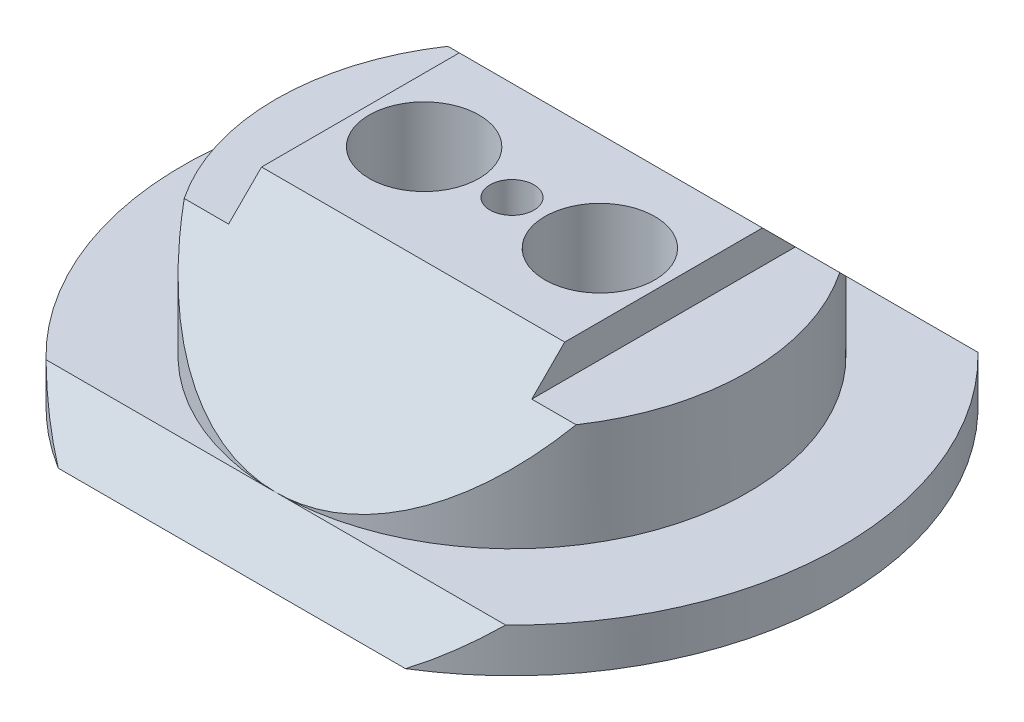
ISO-10303-21;
HEADER;
FILE_DESCRIPTION(('STEP AP214'),'2;1');
FILE_NAME('part.step','',(''),(''),'','','');
FILE_SCHEMA(('AUTOMOTIVE_DESIGN { 1 0 10303 214 1 1 1 1 }'));
ENDSEC;
DATA;
#1=APPLICATION_CONTEXT('core data for automotive mechanical design processes');
#2=APPLICATION_PROTOCOL_DEFINITION('international standard','automotive_design',2000,#1);
#3=PRODUCT_CONTEXT('',#1,'mechanical');
#4=PRODUCT('Part','Part','',(#3));
#5=PRODUCT_RELATED_PRODUCT_CATEGORY('part','',(#4));
#6=PRODUCT_DEFINITION_FORMATION('','',#4);
#7=PRODUCT_DEFINITION_CONTEXT('part definition',#1,'design');
#8=PRODUCT_DEFINITION('design','',#6,#7);
#9=PRODUCT_DEFINITION_SHAPE('','',#8);
#10=(LENGTH_UNIT() NAMED_UNIT(*) SI_UNIT(.MILLI.,.METRE.));
#11=(NAMED_UNIT(*) PLANE_ANGLE_UNIT() SI_UNIT($,.RADIAN.));
#12=(NAMED_UNIT(*) SI_UNIT($,.STERADIAN.) SOLID_ANGLE_UNIT());
#13=UNCERTAINTY_MEASURE_WITH_UNIT(LENGTH_MEASURE(1.E-05),#10,'distance_accuracy_value','');
#14=(GEOMETRIC_REPRESENTATION_CONTEXT(3) GLOBAL_UNCERTAINTY_ASSIGNED_CONTEXT((#13)) GLOBAL_UNIT_ASSIGNED_CONTEXT((#10,
#11,#12)) REPRESENTATION_CONTEXT('',''));
#15=CARTESIAN_POINT('',(0.,0.,0.));
#16=DIRECTION('',(0.,0.,1.));
#17=DIRECTION('',(1.,0.,0.));
#18=AXIS2_PLACEMENT_3D('',#15,#16,#17);
#19=CARTESIAN_POINT('',(0.,20.,0.));
#20=DIRECTION('',(0.,-1.,0.));
#21=DIRECTION('',(0.,0.,-1.));
#22=AXIS2_PLACEMENT_3D('',#19,#20,#21);
#23=CYLINDRICAL_SURFACE('',#22,1.5);
#24=CARTESIAN_POINT('',(0.,0.,0.));
#25=DIRECTION('',(0.,-1.,0.));
#26=DIRECTION('',(0.,0.,-1.));
#27=AXIS2_PLACEMENT_3D('',#24,#25,#26);
#28=CIRCLE('',#27,1.5);
#29=CARTESIAN_POINT('',(0.,0.,-1.5));
#30=VERTEX_POINT('',#29);
#31=EDGE_CURVE('E157',#30,#30,#28,.T.);
#32=ORIENTED_EDGE('',*,*,#31,.T.);
#33=EDGE_LOOP('',(#32));
#34=FACE_BOUND('',#33,.T.);
#35=CARTESIAN_POINT('',(0.,13.5,0.));
#36=DIRECTION('',(0.,1.,0.));
#37=DIRECTION('',(0.,0.,1.));
#38=AXIS2_PLACEMENT_3D('',#35,#36,#37);
#39=CIRCLE('',#38,1.5);
#40=CARTESIAN_POINT('',(0.,13.5,1.5));
#41=VERTEX_POINT('',#40);
#42=EDGE_CURVE('E61',#41,#41,#39,.F.);
#43=ORIENTED_EDGE('',*,*,#42,.F.);
#44=EDGE_LOOP('',(#43));
#45=FACE_BOUND('',#44,.T.);
#46=ADVANCED_FACE('F57',(#34,#45),#23,.F.);
#47=CARTESIAN_POINT('',(0.,0.,0.));
#48=DIRECTION('',(0.,1.,0.));
#49=DIRECTION('',(0.,0.,1.));
#50=AXIS2_PLACEMENT_3D('',#47,#48,#49);
#51=PLANE('',#50);
#52=CARTESIAN_POINT('',(-14.,0.,12.));
#53=DIRECTION('',(0.,-1.,0.));
#54=DIRECTION('',(0.,0.,-1.));
#55=AXIS2_PLACEMENT_3D('',#52,#53,#54);
#56=CIRCLE('',#55,5.);
#57=CARTESIAN_POINT('',(-14.,0.,7.));
#58=VERTEX_POINT('',#57);
#59=EDGE_CURVE('E626',#58,#58,#56,.T.);
#60=ORIENTED_EDGE('',*,*,#59,.F.);
#61=EDGE_LOOP('',(#60));
#62=FACE_BOUND('',#61,.T.);
#63=CARTESIAN_POINT('',(22.,0.,0.));
#64=DIRECTION('',(0.,-1.,0.));
#65=DIRECTION('',(0.,0.,-1.));
#66=AXIS2_PLACEMENT_3D('',#63,#64,#65);
#67=CIRCLE('',#66,5.);
#68=CARTESIAN_POINT('',(22.,0.,-5.));
#69=VERTEX_POINT('',#68);
#70=EDGE_CURVE('E625',#69,#69,#67,.T.);
#71=ORIENTED_EDGE('',*,*,#70,.F.);
#72=EDGE_LOOP('',(#71));
#73=FACE_BOUND('',#72,.T.);
#74=CARTESIAN_POINT('',(-22.,0.,0.));
#75=DIRECTION('',(0.,-1.,0.));
#76=DIRECTION('',(0.,0.,-1.));
#77=AXIS2_PLACEMENT_3D('',#74,#75,#76);
#78=CIRCLE('',#77,5.);
#79=CARTESIAN_POINT('',(-22.,0.,-5.));
#80=VERTEX_POINT('',#79);
#81=EDGE_CURVE('E651',#80,#80,#78,.T.);
#82=ORIENTED_EDGE('',*,*,#81,.F.);
#83=EDGE_LOOP('',(#82));
#84=FACE_BOUND('',#83,.T.);
#85=CARTESIAN_POINT('',(0.,0.,15.));
#86=DIRECTION('',(0.,-1.,0.));
#87=DIRECTION('',(0.,0.,-1.));
#88=AXIS2_PLACEMENT_3D('',#85,#86,#87);
#89=CIRCLE('',#88,5.);
#90=CARTESIAN_POINT('',(0.,0.,10.));
#91=VERTEX_POINT('',#90);
#92=EDGE_CURVE('E643',#91,#91,#89,.T.);
#93=ORIENTED_EDGE('',*,*,#92,.F.);
#94=EDGE_LOOP('',(#93));
#95=FACE_BOUND('',#94,.T.);
#96=CARTESIAN_POINT('',(14.,0.,-12.));
#97=DIRECTION('',(0.,-1.,0.));
#98=DIRECTION('',(0.,0.,-1.));
#99=AXIS2_PLACEMENT_3D('',#96,#97,#98);
#100=CIRCLE('',#99,5.);
#101=CARTESIAN_POINT('',(14.,0.,-17.));
#102=VERTEX_POINT('',#101);
#103=EDGE_CURVE('E698',#102,#102,#100,.T.);
#104=ORIENTED_EDGE('',*,*,#103,.F.);
#105=EDGE_LOOP('',(#104));
#106=FACE_BOUND('',#105,.T.);
#107=CARTESIAN_POINT('',(-14.,0.,-12.));
#108=DIRECTION('',(0.,-1.,0.));
#109=DIRECTION('',(0.,0.,-1.));
#110=AXIS2_PLACEMENT_3D('',#107,#108,#109);
#111=CIRCLE('',#110,5.);
#112=CARTESIAN_POINT('',(-14.,0.,-17.));
#113=VERTEX_POINT('',#112);
#114=EDGE_CURVE('E682',#113,#113,#111,.T.);
#115=ORIENTED_EDGE('',*,*,#114,.F.);
#116=EDGE_LOOP('',(#115));
#117=FACE_BOUND('',#116,.T.);
#118=CARTESIAN_POINT('',(14.,0.,12.));
#119=DIRECTION('',(0.,-1.,0.));
#120=DIRECTION('',(0.,0.,-1.));
#121=AXIS2_PLACEMENT_3D('',#118,#119,#120);
#122=CIRCLE('',#121,5.);
#123=CARTESIAN_POINT('',(14.,0.,7.));
#124=VERTEX_POINT('',#123);
#125=EDGE_CURVE('E691',#124,#124,#122,.T.);
#126=ORIENTED_EDGE('',*,*,#125,.F.);
#127=EDGE_LOOP('',(#126));
#128=FACE_BOUND('',#127,.T.);
#129=CARTESIAN_POINT('',(0.,0.,-15.));
#130=DIRECTION('',(0.,-1.,0.));
#131=DIRECTION('',(0.,0.,-1.));
#132=AXIS2_PLACEMENT_3D('',#129,#130,#131);
#133=CIRCLE('',#132,5.);
#134=CARTESIAN_POINT('',(0.,0.,-20.));
#135=VERTEX_POINT('',#134);
#136=EDGE_CURVE('E642',#135,#135,#133,.T.);
#137=ORIENTED_EDGE('',*,*,#136,.F.);
#138=EDGE_LOOP('',(#137));
#139=FACE_BOUND('',#138,.T.);
#140=ORIENTED_EDGE('',*,*,#31,.F.);
#141=EDGE_LOOP('',(#140));
#142=FACE_BOUND('',#141,.T.);
#143=CARTESIAN_POINT('',(-8.,0.,0.));
#144=DIRECTION('',(0.,1.,0.));
#145=DIRECTION('',(0.,0.,1.));
#146=AXIS2_PLACEMENT_3D('',#143,#144,#145);
#147=CIRCLE('',#146,5.005);
#148=CARTESIAN_POINT('',(-8.,0.,5.005));
#149=VERTEX_POINT('',#148);
#150=EDGE_CURVE('E197',#149,#149,#147,.T.);
#151=ORIENTED_EDGE('',*,*,#150,.T.);
#152=EDGE_LOOP('',(#151));
#153=FACE_BOUND('',#152,.T.);
#154=CARTESIAN_POINT('',(8.,0.,0.));
#155=DIRECTION('',(0.,1.,0.));
#156=DIRECTION('',(0.,0.,1.));
#157=AXIS2_PLACEMENT_3D('',#154,#155,#156);
#158=CIRCLE('',#157,5.005);
#159=CARTESIAN_POINT('',(8.,0.,5.005));
#160=VERTEX_POINT('',#159);
#161=EDGE_CURVE('E190',#160,#160,#158,.T.);
#162=ORIENTED_EDGE('',*,*,#161,.T.);
#163=EDGE_LOOP('',(#162));
#164=FACE_BOUND('',#163,.T.);
#165=DIRECTION('',(1.,0.,0.));
#166=VECTOR('',#165,1.);
#167=CARTESIAN_POINT('',(0.,0.,25.5));
#168=LINE('',#167,#166);
#169=CARTESIAN_POINT('',(-15.8034806292791,0.,25.5));
#170=VERTEX_POINT('',#169);
#171=CARTESIAN_POINT('',(15.8034806292791,0.,25.5));
#172=VERTEX_POINT('',#171);
#173=EDGE_CURVE('E220',#170,#172,#168,.T.);
#174=ORIENTED_EDGE('',*,*,#173,.F.);
#175=CARTESIAN_POINT('',(0.,0.,0.));
#176=DIRECTION('',(0.,1.,0.));
#177=DIRECTION('',(0.,0.,1.));
#178=AXIS2_PLACEMENT_3D('',#175,#176,#177);
#179=CIRCLE('',#178,30.);
#180=CARTESIAN_POINT('',(-15.8034806292789,0.,-25.5000000000001));
#181=VERTEX_POINT('',#180);
#182=EDGE_CURVE('E250',#181,#170,#179,.T.);
#183=ORIENTED_EDGE('',*,*,#182,.F.);
#184=DIRECTION('',(-1.,0.,0.));
#185=VECTOR('',#184,1.);
#186=CARTESIAN_POINT('',(0.,0.,-25.5000000000001));
#187=LINE('',#186,#185);
#188=CARTESIAN_POINT('',(15.8034806292789,0.,-25.5000000000001));
#189=VERTEX_POINT('',#188);
#190=EDGE_CURVE('E224',#189,#181,#187,.T.);
#191=ORIENTED_EDGE('',*,*,#190,.F.);
#192=EDGE_CURVE('E239',#172,#189,#179,.T.);
#193=ORIENTED_EDGE('',*,*,#192,.F.);
#194=EDGE_LOOP('',(#174,#183,#191,#193));
#195=FACE_BOUND('',#194,.T.);
#196=ADVANCED_FACE('F307',(#62,#73,#84,#95,#106,#117,#128,#139,#142,#153,#164,#195),#51,.F.);
#197=CARTESIAN_POINT('',(0.,4.,0.));
#198=DIRECTION('',(0.,-1.,0.));
#199=DIRECTION('',(0.,0.,-1.));
#200=AXIS2_PLACEMENT_3D('',#197,#198,#199);
#201=CYLINDRICAL_SURFACE('',#200,30.);
#202=CARTESIAN_POINT('',(0.,4.,0.));
#203=DIRECTION('',(0.,1.,0.));
#204=DIRECTION('',(0.,0.,1.));
#205=AXIS2_PLACEMENT_3D('',#202,#203,#204);
#206=CIRCLE('',#205,30.);
#207=CARTESIAN_POINT('',(20.9224759529077,4.,21.5));
#208=VERTEX_POINT('',#207);
#209=CARTESIAN_POINT('',(20.9224759529077,4.,-21.5));
#210=VERTEX_POINT('',#209);
#211=EDGE_CURVE('E213',#208,#210,#206,.T.);
#212=ORIENTED_EDGE('',*,*,#211,.F.);
#213=CARTESIAN_POINT('',(0.,25.4999999999998,0.));
#214=DIRECTION('',(0.,-0.707106781186551,-0.707106781186544));
#215=DIRECTION('',(0.,-0.707106781186544,0.707106781186551));
#216=AXIS2_PLACEMENT_3D('',#213,#214,#215);
#217=ELLIPSE('',#216,42.4264068711926,30.);
#218=EDGE_CURVE('E240',#172,#208,#217,.F.);
#219=ORIENTED_EDGE('',*,*,#218,.F.);
#220=ORIENTED_EDGE('',*,*,#192,.T.);
#221=CARTESIAN_POINT('',(0.,25.4999999999995,0.));
#222=DIRECTION('',(0.,-0.707106781186556,0.707106781186539));
#223=DIRECTION('',(0.,-0.707106781186539,-0.707106781186556));
#224=AXIS2_PLACEMENT_3D('',#221,#222,#223);
#225=ELLIPSE('',#224,42.4264068711924,30.);
#226=EDGE_CURVE('E236',#210,#189,#225,.F.);
#227=ORIENTED_EDGE('',*,*,#226,.F.);
#228=EDGE_LOOP('',(#212,#219,#220,#227));
#229=FACE_BOUND('',#228,.T.);
#230=ADVANCED_FACE('F59',(#229),#201,.T.);
#231=CARTESIAN_POINT('',(0.,4.,0.));
#232=DIRECTION('',(0.,1.,0.));
#233=DIRECTION('',(0.,0.,1.));
#234=AXIS2_PLACEMENT_3D('',#231,#232,#233);
#235=CIRCLE('',#234,30.);
#236=CARTESIAN_POINT('',(-20.9224759529077,4.,-21.5));
#237=VERTEX_POINT('',#236);
#238=CARTESIAN_POINT('',(-20.9224759529077,4.,21.5));
#239=VERTEX_POINT('',#238);
#240=EDGE_CURVE('E210',#237,#239,#235,.T.);
#241=ORIENTED_EDGE('',*,*,#240,.F.);
#242=CARTESIAN_POINT('',(0.,25.4999999999995,0.));
#243=DIRECTION('',(0.,0.707106781186556,-0.707106781186539));
#244=DIRECTION('',(0.,-0.707106781186539,-0.707106781186556));
#245=AXIS2_PLACEMENT_3D('',#242,#243,#244);
#246=ELLIPSE('',#245,42.4264068711924,30.);
#247=EDGE_CURVE('E228',#237,#181,#246,.F.);
#248=ORIENTED_EDGE('',*,*,#247,.T.);
#249=ORIENTED_EDGE('',*,*,#182,.T.);
#250=CARTESIAN_POINT('',(0.,25.4999999999998,0.));
#251=DIRECTION('',(0.,0.707106781186551,0.707106781186544));
#252=DIRECTION('',(0.,-0.707106781186544,0.707106781186551));
#253=AXIS2_PLACEMENT_3D('',#250,#251,#252);
#254=ELLIPSE('',#253,42.4264068711926,30.);
#255=EDGE_CURVE('E231',#170,#239,#254,.F.);
#256=ORIENTED_EDGE('',*,*,#255,.T.);
#257=EDGE_LOOP('',(#241,#248,#249,#256));
#258=FACE_BOUND('',#257,.T.);
#259=ADVANCED_FACE('F316',(#258),#201,.T.);
#260=CARTESIAN_POINT('',(30.001,16.5,8.99999999999987));
#261=DIRECTION('',(0.,-0.707106781186551,-0.707106781186544));
#262=DIRECTION('',(0.,0.707106781186544,-0.707106781186551));
#263=AXIS2_PLACEMENT_3D('',#260,#261,#262);
#264=PLANE('',#263);
#265=DIRECTION('',(1.,0.,0.));
#266=VECTOR('',#265,1.);
#267=CARTESIAN_POINT('',(30.001,4.,21.5));
#268=LINE('',#267,#266);
#269=CARTESIAN_POINT('',(0.,3.99999999999999,21.5));
#270=VERTEX_POINT('',#269);
#271=EDGE_CURVE('E219',#239,#270,#268,.T.);
#272=ORIENTED_EDGE('',*,*,#271,.F.);
#273=ORIENTED_EDGE('',*,*,#255,.F.);
#274=ORIENTED_EDGE('',*,*,#173,.T.);
#275=ORIENTED_EDGE('',*,*,#218,.T.);
#276=EDGE_CURVE('E216',#270,#208,#268,.T.);
#277=ORIENTED_EDGE('',*,*,#276,.F.);
#278=EDGE_LOOP('',(#272,#273,#274,#275,#277));
#279=FACE_BOUND('',#278,.T.);
#280=ADVANCED_FACE('F299',(#279),#264,.F.);
#281=CARTESIAN_POINT('',(30.001,16.5,-8.99999999999971));
#282=DIRECTION('',(0.,-0.707106781186556,0.707106781186539));
#283=DIRECTION('',(0.,-0.707106781186539,-0.707106781186556));
#284=AXIS2_PLACEMENT_3D('',#281,#282,#283);
#285=PLANE('',#284);
#286=DIRECTION('',(-1.,0.,0.));
#287=VECTOR('',#286,1.);
#288=CARTESIAN_POINT('',(30.001,4.,-21.5));
#289=LINE('',#288,#287);
#290=CARTESIAN_POINT('',(0.,4.,-21.5));
#291=VERTEX_POINT('',#290);
#292=EDGE_CURVE('E260',#210,#291,#289,.T.);
#293=ORIENTED_EDGE('',*,*,#292,.F.);
#294=ORIENTED_EDGE('',*,*,#226,.T.);
#295=ORIENTED_EDGE('',*,*,#190,.T.);
#296=ORIENTED_EDGE('',*,*,#247,.F.);
#297=EDGE_CURVE('E257',#291,#237,#289,.T.);
#298=ORIENTED_EDGE('',*,*,#297,.F.);
#299=EDGE_LOOP('',(#293,#294,#295,#296,#298));
#300=FACE_BOUND('',#299,.T.);
#301=ADVANCED_FACE('F314',(#300),#285,.F.);
#302=CARTESIAN_POINT('',(0.,96.0338927753446,0.));
#303=DIRECTION('',(0.,-1.,0.));
#304=DIRECTION('',(0.,0.,-1.));
#305=AXIS2_PLACEMENT_3D('',#302,#303,#304);
#306=CYLINDRICAL_SURFACE('',#305,21.5);
#307=CARTESIAN_POINT('',(0.,13.5,0.));
#308=DIRECTION('',(0.,-1.,0.));
#309=DIRECTION('',(1.,0.,0.));
#310=AXIS2_PLACEMENT_3D('',#307,#308,#309);
#311=CIRCLE('',#310,21.5);
#312=CARTESIAN_POINT('',(17.8395627749114,13.5,-11.9999999999998));
#313=VERTEX_POINT('',#312);
#314=CARTESIAN_POINT('',(17.8395627749114,13.5,11.9999999999999));
#315=VERTEX_POINT('',#314);
#316=EDGE_CURVE('E178',#313,#315,#311,.T.);
#317=ORIENTED_EDGE('',*,*,#316,.T.);
#318=CARTESIAN_POINT('',(0.,25.4999999999998,0.));
#319=DIRECTION('',(0.,-0.707106781186551,-0.707106781186544));
#320=DIRECTION('',(0.,-0.707106781186544,0.707106781186551));
#321=AXIS2_PLACEMENT_3D('',#318,#319,#320);
#322=ELLIPSE('',#321,30.4055915910214,21.5);
#323=EDGE_CURVE('E209',#270,#315,#322,.F.);
#324=ORIENTED_EDGE('',*,*,#323,.F.);
#325=CARTESIAN_POINT('',(0.,4.,0.));
#326=DIRECTION('',(0.,1.,0.));
#327=DIRECTION('',(0.,0.,1.));
#328=AXIS2_PLACEMENT_3D('',#325,#326,#327);
#329=CIRCLE('',#328,21.5);
#330=EDGE_CURVE('E202',#270,#291,#329,.T.);
#331=ORIENTED_EDGE('',*,*,#330,.T.);
#332=CARTESIAN_POINT('',(0.,25.4999999999995,0.));
#333=DIRECTION('',(0.,-0.707106781186556,0.707106781186539));
#334=DIRECTION('',(0.,-0.707106781186539,-0.707106781186556));
#335=AXIS2_PLACEMENT_3D('',#332,#333,#334);
#336=ELLIPSE('',#335,30.4055915910212,21.5);
#337=EDGE_CURVE('E254',#313,#291,#336,.F.);
#338=ORIENTED_EDGE('',*,*,#337,.F.);
#339=EDGE_LOOP('',(#317,#324,#331,#338));
#340=FACE_BOUND('',#339,.T.);
#341=ADVANCED_FACE('F290',(#340),#306,.T.);
#342=CARTESIAN_POINT('',(0.,4.,0.));
#343=DIRECTION('',(0.,1.,0.));
#344=DIRECTION('',(0.,0.,1.));
#345=AXIS2_PLACEMENT_3D('',#342,#343,#344);
#346=PLANE('',#345);
#347=ORIENTED_EDGE('',*,*,#276,.T.);
#348=ORIENTED_EDGE('',*,*,#211,.T.);
#349=ORIENTED_EDGE('',*,*,#292,.T.);
#350=ORIENTED_EDGE('',*,*,#330,.F.);
#351=EDGE_LOOP('',(#347,#348,#349,#350));
#352=FACE_BOUND('',#351,.T.);
#353=ADVANCED_FACE('F296',(#352),#346,.T.);
#354=ORIENTED_EDGE('',*,*,#271,.T.);
#355=EDGE_CURVE('E201',#291,#270,#329,.T.);
#356=ORIENTED_EDGE('',*,*,#355,.F.);
#357=ORIENTED_EDGE('',*,*,#297,.T.);
#358=ORIENTED_EDGE('',*,*,#240,.T.);
#359=EDGE_LOOP('',(#354,#356,#357,#358));
#360=FACE_BOUND('',#359,.T.);
#361=ADVANCED_FACE('F283',(#360),#346,.T.);
#362=CARTESIAN_POINT('',(-17.8395627749113,13.5,11.9999999999999));
#363=VERTEX_POINT('',#362);
#364=EDGE_CURVE('E206',#363,#270,#322,.F.);
#365=ORIENTED_EDGE('',*,*,#364,.F.);
#366=CARTESIAN_POINT('',(0.,13.5,0.));
#367=DIRECTION('',(0.,-1.,0.));
#368=DIRECTION('',(0.,0.,-1.));
#369=AXIS2_PLACEMENT_3D('',#366,#367,#368);
#370=CIRCLE('',#369,21.5);
#371=CARTESIAN_POINT('',(-17.8395627749114,13.5,-11.9999999999998));
#372=VERTEX_POINT('',#371);
#373=EDGE_CURVE('E74',#363,#372,#370,.T.);
#374=ORIENTED_EDGE('',*,*,#373,.T.);
#375=EDGE_CURVE('E162',#291,#372,#336,.F.);
#376=ORIENTED_EDGE('',*,*,#375,.F.);
#377=ORIENTED_EDGE('',*,*,#355,.T.);
#378=EDGE_LOOP('',(#365,#374,#376,#377));
#379=FACE_BOUND('',#378,.T.);
#380=ADVANCED_FACE('F275',(#379),#306,.T.);
#381=DIRECTION('',(1.,0.,0.));
#382=VECTOR('',#381,1.);
#383=CARTESIAN_POINT('',(30.001,13.5,-11.9999999999998));
#384=LINE('',#383,#382);
#385=CARTESIAN_POINT('',(-13.8,13.5,-11.9999999999998));
#386=VERTEX_POINT('',#385);
#387=EDGE_CURVE('E153',#372,#386,#384,.T.);
#388=ORIENTED_EDGE('',*,*,#387,.T.);
#389=DIRECTION('',(0.,0.707106781186539,0.707106781186556));
#390=VECTOR('',#389,1.);
#391=CARTESIAN_POINT('',(-13.8,16.5,-8.99999999999971));
#392=LINE('',#391,#390);
#393=CARTESIAN_POINT('',(-13.8,16.5,-8.99999999999971));
#394=VERTEX_POINT('',#393);
#395=EDGE_CURVE('E142',#386,#394,#392,.T.);
#396=ORIENTED_EDGE('',*,*,#395,.T.);
#397=DIRECTION('',(-1.,0.,0.));
#398=VECTOR('',#397,1.);
#399=CARTESIAN_POINT('',(30.001,16.5,-8.99999999999971));
#400=LINE('',#399,#398);
#401=CARTESIAN_POINT('',(13.8,16.5,-8.99999999999971));
#402=VERTEX_POINT('',#401);
#403=EDGE_CURVE('E244',#402,#394,#400,.T.);
#404=ORIENTED_EDGE('',*,*,#403,.F.);
#405=DIRECTION('',(0.,-0.707106781186539,-0.707106781186556));
#406=VECTOR('',#405,1.);
#407=CARTESIAN_POINT('',(13.8,16.5,-8.99999999999971));
#408=LINE('',#407,#406);
#409=CARTESIAN_POINT('',(13.8,13.5,-11.9999999999998));
#410=VERTEX_POINT('',#409);
#411=EDGE_CURVE('E172',#402,#410,#408,.T.);
#412=ORIENTED_EDGE('',*,*,#411,.T.);
#413=DIRECTION('',(1.,0.,0.));
#414=VECTOR('',#413,1.);
#415=CARTESIAN_POINT('',(30.001,13.5,-11.9999999999998));
#416=LINE('',#415,#414);
#417=EDGE_CURVE('E181',#410,#313,#416,.T.);
#418=ORIENTED_EDGE('',*,*,#417,.T.);
#419=ORIENTED_EDGE('',*,*,#337,.T.);
#420=ORIENTED_EDGE('',*,*,#375,.T.);
#421=EDGE_LOOP('',(#388,#396,#404,#412,#418,#419,#420));
#422=FACE_BOUND('',#421,.T.);
#423=ADVANCED_FACE('F160',(#422),#285,.F.);
#424=CARTESIAN_POINT('',(30.001,16.5,8.99999999999987));
#425=DIRECTION('',(0.,-1.,0.));
#426=DIRECTION('',(0.,0.,-1.));
#427=AXIS2_PLACEMENT_3D('',#424,#425,#426);
#428=PLANE('',#427);
#429=CARTESIAN_POINT('',(0.,16.5,0.));
#430=DIRECTION('',(0.,1.,0.));
#431=DIRECTION('',(0.,0.,1.));
#432=AXIS2_PLACEMENT_3D('',#429,#430,#431);
#433=CIRCLE('',#432,2.);
#434=CARTESIAN_POINT('',(0.,16.5,2.00000000000001));
#435=VERTEX_POINT('',#434);
#436=EDGE_CURVE('E659',#435,#435,#433,.T.);
#437=ORIENTED_EDGE('',*,*,#436,.F.);
#438=EDGE_LOOP('',(#437));
#439=FACE_BOUND('',#438,.T.);
#440=CARTESIAN_POINT('',(-8.,16.5,0.));
#441=DIRECTION('',(0.,1.,0.));
#442=DIRECTION('',(0.,0.,1.));
#443=AXIS2_PLACEMENT_3D('',#440,#441,#442);
#444=CIRCLE('',#443,5.005);
#445=CARTESIAN_POINT('',(-8.,16.5,5.00500000000001));
#446=VERTEX_POINT('',#445);
#447=EDGE_CURVE('E186',#446,#446,#444,.T.);
#448=ORIENTED_EDGE('',*,*,#447,.F.);
#449=EDGE_LOOP('',(#448));
#450=FACE_BOUND('',#449,.T.);
#451=CARTESIAN_POINT('',(8.,16.5,0.));
#452=DIRECTION('',(0.,1.,0.));
#453=DIRECTION('',(0.,0.,1.));
#454=AXIS2_PLACEMENT_3D('',#451,#452,#453);
#455=CIRCLE('',#454,5.005);
#456=CARTESIAN_POINT('',(8.,16.5,5.00500000000001));
#457=VERTEX_POINT('',#456);
#458=EDGE_CURVE('E185',#457,#457,#455,.T.);
#459=ORIENTED_EDGE('',*,*,#458,.F.);
#460=EDGE_LOOP('',(#459));
#461=FACE_BOUND('',#460,.T.);
#462=ORIENTED_EDGE('',*,*,#403,.T.);
#463=DIRECTION('',(0.,0.,1.));
#464=VECTOR('',#463,1.);
#465=CARTESIAN_POINT('',(-13.8,16.5,-25.5000000000001));
#466=LINE('',#465,#464);
#467=CARTESIAN_POINT('',(-13.8,16.5,8.99999999999986));
#468=VERTEX_POINT('',#467);
#469=EDGE_CURVE('E147',#394,#468,#466,.T.);
#470=ORIENTED_EDGE('',*,*,#469,.T.);
#471=DIRECTION('',(-1.,0.,0.));
#472=VECTOR('',#471,1.);
#473=CARTESIAN_POINT('',(30.001,16.5,8.99999999999987));
#474=LINE('',#473,#472);
#475=CARTESIAN_POINT('',(13.8,16.5,8.99999999999987));
#476=VERTEX_POINT('',#475);
#477=EDGE_CURVE('E235',#476,#468,#474,.T.);
#478=ORIENTED_EDGE('',*,*,#477,.F.);
#479=DIRECTION('',(0.,0.,1.));
#480=VECTOR('',#479,1.);
#481=CARTESIAN_POINT('',(13.8,16.5,-25.5000000000001));
#482=LINE('',#481,#480);
#483=EDGE_CURVE('E82',#402,#476,#482,.T.);
#484=ORIENTED_EDGE('',*,*,#483,.F.);
#485=EDGE_LOOP('',(#462,#470,#478,#484));
#486=FACE_BOUND('',#485,.T.);
#487=ADVANCED_FACE('F361',(#439,#450,#461,#486),#428,.F.);
#488=ORIENTED_EDGE('',*,*,#477,.T.);
#489=DIRECTION('',(0.,-0.707106781186544,0.707106781186551));
#490=VECTOR('',#489,1.);
#491=CARTESIAN_POINT('',(-13.8,16.5,8.99999999999987));
#492=LINE('',#491,#490);
#493=CARTESIAN_POINT('',(-13.8,13.5,11.9999999999999));
#494=VERTEX_POINT('',#493);
#495=EDGE_CURVE('E13',#468,#494,#492,.T.);
#496=ORIENTED_EDGE('',*,*,#495,.T.);
#497=DIRECTION('',(-1.,0.,0.));
#498=VECTOR('',#497,1.);
#499=CARTESIAN_POINT('',(30.001,13.5,11.9999999999999));
#500=LINE('',#499,#498);
#501=EDGE_CURVE('E67',#494,#363,#500,.T.);
#502=ORIENTED_EDGE('',*,*,#501,.T.);
#503=ORIENTED_EDGE('',*,*,#364,.T.);
#504=ORIENTED_EDGE('',*,*,#323,.T.);
#505=DIRECTION('',(-1.,0.,0.));
#506=VECTOR('',#505,1.);
#507=CARTESIAN_POINT('',(30.001,13.5,11.9999999999999));
#508=LINE('',#507,#506);
#509=CARTESIAN_POINT('',(13.8,13.5,11.9999999999999));
#510=VERTEX_POINT('',#509);
#511=EDGE_CURVE('E264',#315,#510,#508,.T.);
#512=ORIENTED_EDGE('',*,*,#511,.T.);
#513=DIRECTION('',(0.,0.707106781186544,-0.707106781186551));
#514=VECTOR('',#513,1.);
#515=CARTESIAN_POINT('',(13.8,16.5,8.99999999999987));
#516=LINE('',#515,#514);
#517=EDGE_CURVE('E261',#510,#476,#516,.T.);
#518=ORIENTED_EDGE('',*,*,#517,.T.);
#519=EDGE_LOOP('',(#488,#496,#502,#503,#504,#512,#518));
#520=FACE_BOUND('',#519,.T.);
#521=ADVANCED_FACE('F271',(#520),#264,.F.);
#522=CARTESIAN_POINT('',(8.,-7.50000000000001,0.));
#523=DIRECTION('',(0.,1.,0.));
#524=DIRECTION('',(0.,0.,1.));
#525=AXIS2_PLACEMENT_3D('',#522,#523,#524);
#526=CYLINDRICAL_SURFACE('',#525,5.005);
#527=ORIENTED_EDGE('',*,*,#458,.T.);
#528=EDGE_LOOP('',(#527));
#529=FACE_BOUND('',#528,.T.);
#530=ORIENTED_EDGE('',*,*,#161,.F.);
#531=EDGE_LOOP('',(#530));
#532=FACE_BOUND('',#531,.T.);
#533=ADVANCED_FACE('F351',(#529,#532),#526,.F.);
#534=CARTESIAN_POINT('',(-8.,-7.50000000000001,0.));
#535=DIRECTION('',(0.,1.,0.));
#536=DIRECTION('',(0.,0.,1.));
#537=AXIS2_PLACEMENT_3D('',#534,#535,#536);
#538=CYLINDRICAL_SURFACE('',#537,5.005);
#539=ORIENTED_EDGE('',*,*,#447,.T.);
#540=EDGE_LOOP('',(#539));
#541=FACE_BOUND('',#540,.T.);
#542=ORIENTED_EDGE('',*,*,#150,.F.);
#543=EDGE_LOOP('',(#542));
#544=FACE_BOUND('',#543,.T.);
#545=ADVANCED_FACE('F345',(#541,#544),#538,.F.);
#546=CARTESIAN_POINT('',(21.5,13.5,-25.5000000000001));
#547=DIRECTION('',(0.,-1.,0.));
#548=DIRECTION('',(1.,0.,0.));
#549=AXIS2_PLACEMENT_3D('',#546,#547,#548);
#550=PLANE('',#549);
#551=DIRECTION('',(0.,0.,1.));
#552=VECTOR('',#551,1.);
#553=CARTESIAN_POINT('',(13.8,13.5,-25.5000000000001));
#554=LINE('',#553,#552);
#555=EDGE_CURVE('E168',#410,#510,#554,.T.);
#556=ORIENTED_EDGE('',*,*,#555,.T.);
#557=ORIENTED_EDGE('',*,*,#511,.F.);
#558=ORIENTED_EDGE('',*,*,#316,.F.);
#559=ORIENTED_EDGE('',*,*,#417,.F.);
#560=EDGE_LOOP('',(#556,#557,#558,#559));
#561=FACE_BOUND('',#560,.T.);
#562=ADVANCED_FACE('F342',(#561),#550,.F.);
#563=CARTESIAN_POINT('',(13.8,13.5,-25.5000000000001));
#564=DIRECTION('',(-1.,0.,0.));
#565=DIRECTION('',(0.,0.,1.));
#566=AXIS2_PLACEMENT_3D('',#563,#564,#565);
#567=PLANE('',#566);
#568=ORIENTED_EDGE('',*,*,#483,.T.);
#569=ORIENTED_EDGE('',*,*,#517,.F.);
#570=ORIENTED_EDGE('',*,*,#555,.F.);
#571=ORIENTED_EDGE('',*,*,#411,.F.);
#572=EDGE_LOOP('',(#568,#569,#570,#571));
#573=FACE_BOUND('',#572,.T.);
#574=ADVANCED_FACE('F338',(#573),#567,.F.);
#575=CARTESIAN_POINT('',(-13.8,13.5,-25.5000000000001));
#576=DIRECTION('',(1.,0.,0.));
#577=DIRECTION('',(0.,0.,-1.));
#578=AXIS2_PLACEMENT_3D('',#575,#576,#577);
#579=PLANE('',#578);
#580=DIRECTION('',(0.,0.,1.));
#581=VECTOR('',#580,1.);
#582=CARTESIAN_POINT('',(-13.8,13.5,-25.5000000000001));
#583=LINE('',#582,#581);
#584=EDGE_CURVE('E145',#386,#494,#583,.T.);
#585=ORIENTED_EDGE('',*,*,#584,.T.);
#586=ORIENTED_EDGE('',*,*,#495,.F.);
#587=ORIENTED_EDGE('',*,*,#469,.F.);
#588=ORIENTED_EDGE('',*,*,#395,.F.);
#589=EDGE_LOOP('',(#585,#586,#587,#588));
#590=FACE_BOUND('',#589,.T.);
#591=ADVANCED_FACE('F144',(#590),#579,.F.);
#592=CARTESIAN_POINT('',(-21.5,13.5,-25.5000000000001));
#593=DIRECTION('',(0.,-1.,0.));
#594=DIRECTION('',(0.,0.,-1.));
#595=AXIS2_PLACEMENT_3D('',#592,#593,#594);
#596=PLANE('',#595);
#597=ORIENTED_EDGE('',*,*,#373,.F.);
#598=ORIENTED_EDGE('',*,*,#501,.F.);
#599=ORIENTED_EDGE('',*,*,#584,.F.);
#600=ORIENTED_EDGE('',*,*,#387,.F.);
#601=EDGE_LOOP('',(#597,#598,#599,#600));
#602=FACE_BOUND('',#601,.T.);
#603=ADVANCED_FACE('F155',(#602),#596,.F.);
#604=CARTESIAN_POINT('',(0.,13.5,0.));
#605=DIRECTION('',(0.,1.,0.));
#606=DIRECTION('',(0.,0.,1.));
#607=AXIS2_PLACEMENT_3D('',#604,#605,#606);
#608=PLANE('',#607);
#609=CARTESIAN_POINT('',(0.,13.5,0.));
#610=DIRECTION('',(0.,1.,0.));
#611=DIRECTION('',(0.,0.,1.));
#612=AXIS2_PLACEMENT_3D('',#609,#610,#611);
#613=CIRCLE('',#612,2.);
#614=CARTESIAN_POINT('',(0.,13.5,2.00000000000001));
#615=VERTEX_POINT('',#614);
#616=EDGE_CURVE('E663',#615,#615,#613,.T.);
#617=ORIENTED_EDGE('',*,*,#616,.T.);
#618=EDGE_LOOP('',(#617));
#619=FACE_BOUND('',#618,.T.);
#620=ORIENTED_EDGE('',*,*,#42,.T.);
#621=EDGE_LOOP('',(#620));
#622=FACE_BOUND('',#621,.T.);
#623=ADVANCED_FACE('F341',(#619,#622),#608,.T.);
#624=CARTESIAN_POINT('',(0.,13.5,0.));
#625=DIRECTION('',(0.,1.,0.));
#626=DIRECTION('',(0.,0.,1.));
#627=AXIS2_PLACEMENT_3D('',#624,#625,#626);
#628=CYLINDRICAL_SURFACE('',#627,2.);
#629=ORIENTED_EDGE('',*,*,#616,.F.);
#630=EDGE_LOOP('',(#629));
#631=FACE_BOUND('',#630,.T.);
#632=ORIENTED_EDGE('',*,*,#436,.T.);
#633=EDGE_LOOP('',(#632));
#634=FACE_BOUND('',#633,.T.);
#635=ADVANCED_FACE('F334',(#631,#634),#628,.F.);
#636=CARTESIAN_POINT('',(0.,3.,-15.));
#637=DIRECTION('',(0.,-1.,0.));
#638=DIRECTION('',(0.,0.,-1.));
#639=AXIS2_PLACEMENT_3D('',#636,#637,#638);
#640=CYLINDRICAL_SURFACE('',#639,5.);
#641=CARTESIAN_POINT('',(0.,3.,-15.));
#642=DIRECTION('',(0.,-1.,0.));
#643=DIRECTION('',(0.,0.,-1.));
#644=AXIS2_PLACEMENT_3D('',#641,#642,#643);
#645=CIRCLE('',#644,5.);
#646=CARTESIAN_POINT('',(0.,3.,-20.));
#647=VERTEX_POINT('',#646);
#648=EDGE_CURVE('E655',#647,#647,#645,.T.);
#649=ORIENTED_EDGE('',*,*,#648,.F.);
#650=EDGE_LOOP('',(#649));
#651=FACE_BOUND('',#650,.T.);
#652=ORIENTED_EDGE('',*,*,#136,.T.);
#653=EDGE_LOOP('',(#652));
#654=FACE_BOUND('',#653,.T.);
#655=ADVANCED_FACE('F451',(#651,#654),#640,.F.);
#656=CARTESIAN_POINT('',(0.,3.,-15.));
#657=DIRECTION('',(0.,-1.,0.));
#658=DIRECTION('',(0.,0.,-1.));
#659=AXIS2_PLACEMENT_3D('',#656,#657,#658);
#660=PLANE('',#659);
#661=ORIENTED_EDGE('',*,*,#648,.T.);
#662=EDGE_LOOP('',(#661));
#663=FACE_BOUND('',#662,.T.);
#664=ADVANCED_FACE('F467',(#663),#660,.T.);
#665=CARTESIAN_POINT('',(14.,3.,12.));
#666=DIRECTION('',(0.,-1.,0.));
#667=DIRECTION('',(0.,0.,-1.));
#668=AXIS2_PLACEMENT_3D('',#665,#666,#667);
#669=CYLINDRICAL_SURFACE('',#668,5.);
#670=CARTESIAN_POINT('',(14.,3.,12.));
#671=DIRECTION('',(0.,-1.,0.));
#672=DIRECTION('',(0.,0.,-1.));
#673=AXIS2_PLACEMENT_3D('',#670,#671,#672);
#674=CIRCLE('',#673,5.);
#675=CARTESIAN_POINT('',(14.,3.,7.));
#676=VERTEX_POINT('',#675);
#677=EDGE_CURVE('E634',#676,#676,#674,.T.);
#678=ORIENTED_EDGE('',*,*,#677,.F.);
#679=EDGE_LOOP('',(#678));
#680=FACE_BOUND('',#679,.T.);
#681=ORIENTED_EDGE('',*,*,#125,.T.);
#682=EDGE_LOOP('',(#681));
#683=FACE_BOUND('',#682,.T.);
#684=ADVANCED_FACE('F477',(#680,#683),#669,.F.);
#685=CARTESIAN_POINT('',(14.,3.,12.));
#686=DIRECTION('',(0.,-1.,0.));
#687=DIRECTION('',(0.,0.,-1.));
#688=AXIS2_PLACEMENT_3D('',#685,#686,#687);
#689=PLANE('',#688);
#690=ORIENTED_EDGE('',*,*,#677,.T.);
#691=EDGE_LOOP('',(#690));
#692=FACE_BOUND('',#691,.T.);
#693=ADVANCED_FACE('F487',(#692),#689,.T.);
#694=CARTESIAN_POINT('',(-14.,3.,-12.));
#695=DIRECTION('',(0.,-1.,0.));
#696=DIRECTION('',(0.,0.,-1.));
#697=AXIS2_PLACEMENT_3D('',#694,#695,#696);
#698=CYLINDRICAL_SURFACE('',#697,5.);
#699=CARTESIAN_POINT('',(-14.,3.,-12.));
#700=DIRECTION('',(0.,-1.,0.));
#701=DIRECTION('',(0.,0.,-1.));
#702=AXIS2_PLACEMENT_3D('',#699,#700,#701);
#703=CIRCLE('',#702,5.);
#704=CARTESIAN_POINT('',(-14.,3.,-17.));
#705=VERTEX_POINT('',#704);
#706=EDGE_CURVE('E686',#705,#705,#703,.T.);
#707=ORIENTED_EDGE('',*,*,#706,.F.);
#708=EDGE_LOOP('',(#707));
#709=FACE_BOUND('',#708,.T.);
#710=ORIENTED_EDGE('',*,*,#114,.T.);
#711=EDGE_LOOP('',(#710));
#712=FACE_BOUND('',#711,.T.);
#713=ADVANCED_FACE('F497',(#709,#712),#698,.F.);
#714=CARTESIAN_POINT('',(-14.,3.,-12.));
#715=DIRECTION('',(0.,-1.,0.));
#716=DIRECTION('',(0.,0.,-1.));
#717=AXIS2_PLACEMENT_3D('',#714,#715,#716);
#718=PLANE('',#717);
#719=ORIENTED_EDGE('',*,*,#706,.T.);
#720=EDGE_LOOP('',(#719));
#721=FACE_BOUND('',#720,.T.);
#722=ADVANCED_FACE('F507',(#721),#718,.T.);
#723=CARTESIAN_POINT('',(14.,3.,-12.));
#724=DIRECTION('',(0.,-1.,0.));
#725=DIRECTION('',(0.,0.,-1.));
#726=AXIS2_PLACEMENT_3D('',#723,#724,#725);
#727=CYLINDRICAL_SURFACE('',#726,5.);
#728=CARTESIAN_POINT('',(14.,3.,-12.));
#729=DIRECTION('',(0.,-1.,0.));
#730=DIRECTION('',(0.,0.,-1.));
#731=AXIS2_PLACEMENT_3D('',#728,#729,#730);
#732=CIRCLE('',#731,5.);
#733=CARTESIAN_POINT('',(14.,3.,-17.));
#734=VERTEX_POINT('',#733);
#735=EDGE_CURVE('E687',#734,#734,#732,.T.);
#736=ORIENTED_EDGE('',*,*,#735,.F.);
#737=EDGE_LOOP('',(#736));
#738=FACE_BOUND('',#737,.T.);
#739=ORIENTED_EDGE('',*,*,#103,.T.);
#740=EDGE_LOOP('',(#739));
#741=FACE_BOUND('',#740,.T.);
#742=ADVANCED_FACE('F517',(#738,#741),#727,.F.);
#743=CARTESIAN_POINT('',(14.,3.,-12.));
#744=DIRECTION('',(0.,-1.,0.));
#745=DIRECTION('',(0.,0.,-1.));
#746=AXIS2_PLACEMENT_3D('',#743,#744,#745);
#747=PLANE('',#746);
#748=ORIENTED_EDGE('',*,*,#735,.T.);
#749=EDGE_LOOP('',(#748));
#750=FACE_BOUND('',#749,.T.);
#751=ADVANCED_FACE('F527',(#750),#747,.T.);
#752=CARTESIAN_POINT('',(0.,3.,15.));
#753=DIRECTION('',(0.,-1.,0.));
#754=DIRECTION('',(0.,0.,-1.));
#755=AXIS2_PLACEMENT_3D('',#752,#753,#754);
#756=CYLINDRICAL_SURFACE('',#755,5.);
#757=CARTESIAN_POINT('',(0.,3.,15.));
#758=DIRECTION('',(0.,-1.,0.));
#759=DIRECTION('',(0.,0.,-1.));
#760=AXIS2_PLACEMENT_3D('',#757,#758,#759);
#761=CIRCLE('',#760,5.);
#762=CARTESIAN_POINT('',(0.,3.,10.));
#763=VERTEX_POINT('',#762);
#764=EDGE_CURVE('E638',#763,#763,#761,.T.);
#765=ORIENTED_EDGE('',*,*,#764,.F.);
#766=EDGE_LOOP('',(#765));
#767=FACE_BOUND('',#766,.T.);
#768=ORIENTED_EDGE('',*,*,#92,.T.);
#769=EDGE_LOOP('',(#768));
#770=FACE_BOUND('',#769,.T.);
#771=ADVANCED_FACE('F537',(#767,#770),#756,.F.);
#772=CARTESIAN_POINT('',(0.,3.,15.));
#773=DIRECTION('',(0.,-1.,0.));
#774=DIRECTION('',(0.,0.,-1.));
#775=AXIS2_PLACEMENT_3D('',#772,#773,#774);
#776=PLANE('',#775);
#777=ORIENTED_EDGE('',*,*,#764,.T.);
#778=EDGE_LOOP('',(#777));
#779=FACE_BOUND('',#778,.T.);
#780=ADVANCED_FACE('F547',(#779),#776,.T.);
#781=CARTESIAN_POINT('',(-22.,3.,0.));
#782=DIRECTION('',(0.,-1.,0.));
#783=DIRECTION('',(0.,0.,-1.));
#784=AXIS2_PLACEMENT_3D('',#781,#782,#783);
#785=CYLINDRICAL_SURFACE('',#784,5.);
#786=CARTESIAN_POINT('',(-22.,3.,0.));
#787=DIRECTION('',(0.,-1.,0.));
#788=DIRECTION('',(0.,0.,-1.));
#789=AXIS2_PLACEMENT_3D('',#786,#787,#788);
#790=CIRCLE('',#789,5.);
#791=CARTESIAN_POINT('',(-22.,3.,-5.));
#792=VERTEX_POINT('',#791);
#793=EDGE_CURVE('E647',#792,#792,#790,.T.);
#794=ORIENTED_EDGE('',*,*,#793,.F.);
#795=EDGE_LOOP('',(#794));
#796=FACE_BOUND('',#795,.T.);
#797=ORIENTED_EDGE('',*,*,#81,.T.);
#798=EDGE_LOOP('',(#797));
#799=FACE_BOUND('',#798,.T.);
#800=ADVANCED_FACE('F557',(#796,#799),#785,.F.);
#801=CARTESIAN_POINT('',(-22.,3.,0.));
#802=DIRECTION('',(0.,-1.,0.));
#803=DIRECTION('',(0.,0.,-1.));
#804=AXIS2_PLACEMENT_3D('',#801,#802,#803);
#805=PLANE('',#804);
#806=ORIENTED_EDGE('',*,*,#793,.T.);
#807=EDGE_LOOP('',(#806));
#808=FACE_BOUND('',#807,.T.);
#809=ADVANCED_FACE('F567',(#808),#805,.T.);
#810=CARTESIAN_POINT('',(22.,3.,0.));
#811=DIRECTION('',(0.,-1.,0.));
#812=DIRECTION('',(0.,0.,-1.));
#813=AXIS2_PLACEMENT_3D('',#810,#811,#812);
#814=CYLINDRICAL_SURFACE('',#813,5.);
#815=CARTESIAN_POINT('',(22.,3.,0.));
#816=DIRECTION('',(0.,-1.,0.));
#817=DIRECTION('',(0.,0.,-1.));
#818=AXIS2_PLACEMENT_3D('',#815,#816,#817);
#819=CIRCLE('',#818,5.);
#820=CARTESIAN_POINT('',(22.,3.,-5.));
#821=VERTEX_POINT('',#820);
#822=EDGE_CURVE('E631',#821,#821,#819,.T.);
#823=ORIENTED_EDGE('',*,*,#822,.F.);
#824=EDGE_LOOP('',(#823));
#825=FACE_BOUND('',#824,.T.);
#826=ORIENTED_EDGE('',*,*,#70,.T.);
#827=EDGE_LOOP('',(#826));
#828=FACE_BOUND('',#827,.T.);
#829=ADVANCED_FACE('F577',(#825,#828),#814,.F.);
#830=CARTESIAN_POINT('',(22.,3.,0.));
#831=DIRECTION('',(0.,-1.,0.));
#832=DIRECTION('',(0.,0.,-1.));
#833=AXIS2_PLACEMENT_3D('',#830,#831,#832);
#834=PLANE('',#833);
#835=ORIENTED_EDGE('',*,*,#822,.T.);
#836=EDGE_LOOP('',(#835));
#837=FACE_BOUND('',#836,.T.);
#838=ADVANCED_FACE('F587',(#837),#834,.T.);
#839=CARTESIAN_POINT('',(-14.,3.,12.));
#840=DIRECTION('',(0.,-1.,0.));
#841=DIRECTION('',(0.,0.,-1.));
#842=AXIS2_PLACEMENT_3D('',#839,#840,#841);
#843=CYLINDRICAL_SURFACE('',#842,5.);
#844=CARTESIAN_POINT('',(-14.,3.,12.));
#845=DIRECTION('',(0.,-1.,0.));
#846=DIRECTION('',(0.,0.,-1.));
#847=AXIS2_PLACEMENT_3D('',#844,#845,#846);
#848=CIRCLE('',#847,5.);
#849=CARTESIAN_POINT('',(-14.,3.,7.));
#850=VERTEX_POINT('',#849);
#851=EDGE_CURVE('E623',#850,#850,#848,.T.);
#852=ORIENTED_EDGE('',*,*,#851,.F.);
#853=EDGE_LOOP('',(#852));
#854=FACE_BOUND('',#853,.T.);
#855=ORIENTED_EDGE('',*,*,#59,.T.);
#856=EDGE_LOOP('',(#855));
#857=FACE_BOUND('',#856,.T.);
#858=ADVANCED_FACE('F597',(#854,#857),#843,.F.);
#859=CARTESIAN_POINT('',(-14.,3.,12.));
#860=DIRECTION('',(0.,-1.,0.));
#861=DIRECTION('',(0.,0.,-1.));
#862=AXIS2_PLACEMENT_3D('',#859,#860,#861);
#863=PLANE('',#862);
#864=ORIENTED_EDGE('',*,*,#851,.T.);
#865=EDGE_LOOP('',(#864));
#866=FACE_BOUND('',#865,.T.);
#867=ADVANCED_FACE('F607',(#866),#863,.T.);
#868=CLOSED_SHELL('',(#46,#196,#230,#259,#280,#301,#341,#353,#361,#380,#423,#487,#521,#533,#545,
#562,#574,#591,#603,#623,#635,#655,#664,#684,#693,#713,#722,#742,#751,#771,#780,#800,#809,#829,
#838,#858,#867));
#869=MANIFOLD_SOLID_BREP('B2',#868);
#870=ADVANCED_BREP_SHAPE_REPRESENTATION('',(#18,#869),#14);
#871=SHAPE_DEFINITION_REPRESENTATION(#9,#870);
ENDSEC;
END-ISO-10303-21;
